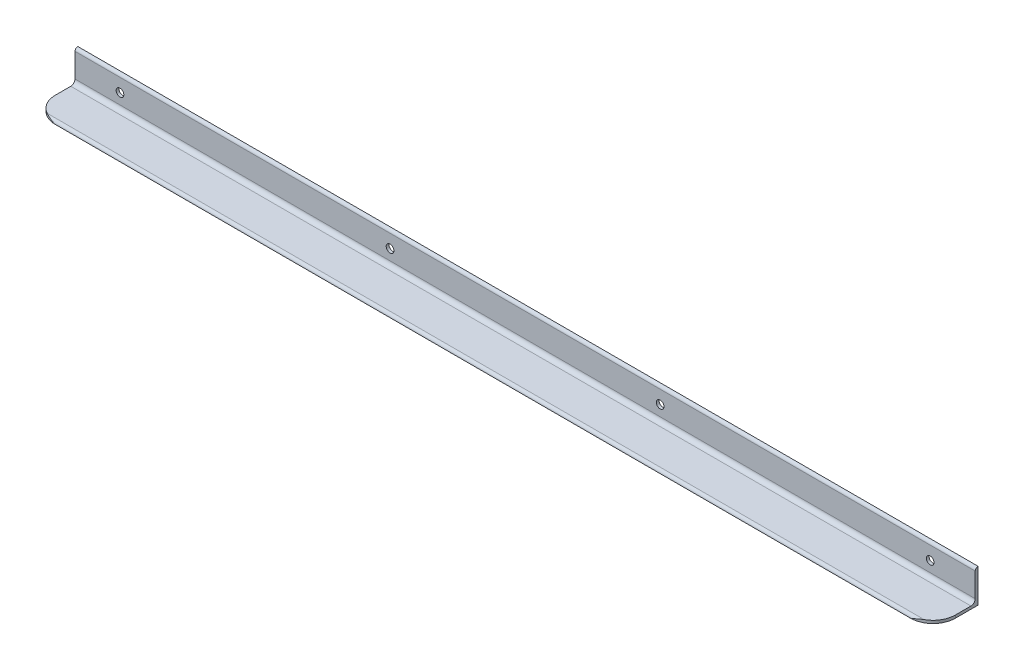
ISO-10303-21;
HEADER;
FILE_DESCRIPTION(('STEP AP214'),'2;1');
FILE_NAME('part.step','',(''),(''),'','','');
FILE_SCHEMA(('AUTOMOTIVE_DESIGN { 1 0 10303 214 1 1 1 1 }'));
ENDSEC;
DATA;
#1=APPLICATION_CONTEXT('core data for automotive mechanical design processes');
#2=APPLICATION_PROTOCOL_DEFINITION('international standard','automotive_design',2000,#1);
#3=PRODUCT_CONTEXT('',#1,'mechanical');
#4=PRODUCT('Part','Part','',(#3));
#5=PRODUCT_RELATED_PRODUCT_CATEGORY('part','',(#4));
#6=PRODUCT_DEFINITION_FORMATION('','',#4);
#7=PRODUCT_DEFINITION_CONTEXT('part definition',#1,'design');
#8=PRODUCT_DEFINITION('design','',#6,#7);
#9=PRODUCT_DEFINITION_SHAPE('','',#8);
#10=(LENGTH_UNIT() NAMED_UNIT(*) SI_UNIT(.MILLI.,.METRE.));
#11=(NAMED_UNIT(*) PLANE_ANGLE_UNIT() SI_UNIT($,.RADIAN.));
#12=(NAMED_UNIT(*) SI_UNIT($,.STERADIAN.) SOLID_ANGLE_UNIT());
#13=UNCERTAINTY_MEASURE_WITH_UNIT(LENGTH_MEASURE(1.E-05),#10,'distance_accuracy_value','');
#14=(GEOMETRIC_REPRESENTATION_CONTEXT(3) GLOBAL_UNCERTAINTY_ASSIGNED_CONTEXT((#13)) GLOBAL_UNIT_ASSIGNED_CONTEXT((#10,
#11,#12)) REPRESENTATION_CONTEXT('',''));
#15=CARTESIAN_POINT('',(0.,0.,0.));
#16=DIRECTION('',(0.,0.,1.));
#17=DIRECTION('',(1.,0.,0.));
#18=AXIS2_PLACEMENT_3D('',#15,#16,#17);
#19=CARTESIAN_POINT('',(508.,6.66133814775094E-13,50.7999999999862));
#20=DIRECTION('',(0.,0.,-0.999999999999999));
#21=DIRECTION('',(-0.999999999999999,0.,0.));
#22=AXIS2_PLACEMENT_3D('',#19,#20,#21);
#23=PLANE('',#22);
#24=DIRECTION('',(-0.999999999999999,0.,0.));
#25=VECTOR('',#24,1.);
#26=CARTESIAN_POINT('',(508.,6.66133814775094E-13,50.7999999999862));
#27=LINE('',#26,#25);
#28=CARTESIAN_POINT('',(482.599999999996,4.44089209850063E-13,50.7999999999865));
#29=VERTEX_POINT('',#28);
#30=CARTESIAN_POINT('',(-482.600000000003,4.44089209850063E-13,50.8000000000133));
#31=VERTEX_POINT('',#30);
#32=EDGE_CURVE('E173',#29,#31,#27,.T.);
#33=ORIENTED_EDGE('',*,*,#32,.F.);
#34=DIRECTION('',(0.,-1.,0.));
#35=VECTOR('',#34,1.);
#36=CARTESIAN_POINT('',(482.599999999996,38.1000000000041,50.799999999986));
#37=LINE('',#36,#35);
#38=CARTESIAN_POINT('',(482.599999999996,0.00508000000054576,50.7999999999862));
#39=VERTEX_POINT('',#38);
#40=EDGE_CURVE('E158',#39,#29,#37,.T.);
#41=ORIENTED_EDGE('',*,*,#40,.F.);
#42=DIRECTION('',(-0.999999999999999,0.,0.));
#43=VECTOR('',#42,1.);
#44=CARTESIAN_POINT('',(508.,0.00508000000065678,50.7999999999864));
#45=LINE('',#44,#43);
#46=CARTESIAN_POINT('',(-482.600000000003,0.0050800000007678,50.8000000000128));
#47=VERTEX_POINT('',#46);
#48=EDGE_CURVE('E179',#39,#47,#45,.T.);
#49=ORIENTED_EDGE('',*,*,#48,.T.);
#50=DIRECTION('',(0.,-1.,0.));
#51=VECTOR('',#50,1.);
#52=CARTESIAN_POINT('',(-482.600000000003,38.1000000000035,50.8000000000132));
#53=LINE('',#52,#51);
#54=EDGE_CURVE('E176',#47,#31,#53,.T.);
#55=ORIENTED_EDGE('',*,*,#54,.T.);
#56=EDGE_LOOP('',(#33,#41,#49,#55));
#57=FACE_BOUND('',#56,.T.);
#58=ADVANCED_FACE('F76',(#57),#23,.F.);
#59=CARTESIAN_POINT('',(507.999999999999,0.00508000000043474,47.6300799999864));
#60=DIRECTION('',(-0.999999999999999,0.,0.));
#61=DIRECTION('',(0.,0.,0.999999999999999));
#62=AXIS2_PLACEMENT_3D('',#59,#60,#61);
#63=PLANE('',#62);
#64=DIRECTION('',(0.,-1.,0.));
#65=VECTOR('',#64,1.);
#66=CARTESIAN_POINT('',(508.,38.1000000000039,25.3999999999862));
#67=LINE('',#66,#65);
#68=CARTESIAN_POINT('',(507.999999999999,4.44089209850063E-13,25.3999999999857));
#69=VERTEX_POINT('',#68);
#70=CARTESIAN_POINT('',(507.999999999999,3.17500000000037,25.3999999999859));
#71=VERTEX_POINT('',#70);
#72=EDGE_CURVE('E15',#69,#71,#67,.F.);
#73=ORIENTED_EDGE('',*,*,#72,.F.);
#74=DIRECTION('',(0.,0.,-0.999999999999999));
#75=VECTOR('',#74,1.);
#76=CARTESIAN_POINT('',(508.,7.7715611723761E-13,-1.4210854715202E-11));
#77=LINE('',#76,#75);
#78=CARTESIAN_POINT('',(508.,7.7715611723761E-13,-1.4210854715202E-11));
#79=VERTEX_POINT('',#78);
#80=EDGE_CURVE('E175',#69,#79,#77,.T.);
#81=ORIENTED_EDGE('',*,*,#80,.T.);
#82=DIRECTION('',(0.,1.,0.));
#83=VECTOR('',#82,1.);
#84=CARTESIAN_POINT('',(508.,38.1000000000036,-1.38777878078145E-11));
#85=LINE('',#84,#83);
#86=CARTESIAN_POINT('',(508.,38.1000000000036,-1.38777878078145E-11));
#87=VERTEX_POINT('',#86);
#88=EDGE_CURVE('E407',#79,#87,#85,.T.);
#89=ORIENTED_EDGE('',*,*,#88,.T.);
#90=DIRECTION('',(0.,0.,0.999999999999999));
#91=VECTOR('',#90,1.);
#92=CARTESIAN_POINT('',(508.,38.1000000000039,0.00507999998611286));
#93=LINE('',#92,#91);
#94=CARTESIAN_POINT('',(508.,38.1000000000039,0.00507999998611286));
#95=VERTEX_POINT('',#94);
#96=EDGE_CURVE('E409',#87,#95,#93,.T.);
#97=ORIENTED_EDGE('',*,*,#96,.T.);
#98=CARTESIAN_POINT('',(508.,34.9300800000039,0.00507999998611286));
#99=DIRECTION('',(0.999999999999999,0.,0.));
#100=DIRECTION('',(0.,0.,-0.999999999999999));
#101=AXIS2_PLACEMENT_3D('',#98,#99,#100);
#102=CIRCLE('',#101,3.16992);
#103=CARTESIAN_POINT('',(508.,34.9300800000041,3.17499999998605));
#104=VERTEX_POINT('',#103);
#105=EDGE_CURVE('E411',#95,#104,#102,.T.);
#106=ORIENTED_EDGE('',*,*,#105,.T.);
#107=DIRECTION('',(0.,-1.,0.));
#108=VECTOR('',#107,1.);
#109=CARTESIAN_POINT('',(508.,7.95020000000057,3.17499999998627));
#110=LINE('',#109,#108);
#111=CARTESIAN_POINT('',(508.,7.95020000000057,3.17499999998627));
#112=VERTEX_POINT('',#111);
#113=EDGE_CURVE('E415',#104,#112,#110,.T.);
#114=ORIENTED_EDGE('',*,*,#113,.T.);
#115=CARTESIAN_POINT('',(507.999999999999,7.95020000000057,7.95019999998636));
#116=DIRECTION('',(-0.999999999999999,0.,0.));
#117=DIRECTION('',(0.,0.,0.999999999999999));
#118=AXIS2_PLACEMENT_3D('',#115,#116,#117);
#119=CIRCLE('',#118,4.7752);
#120=CARTESIAN_POINT('',(507.999999999999,3.17500000000037,7.95019999998603));
#121=VERTEX_POINT('',#120);
#122=EDGE_CURVE('E417',#112,#121,#119,.T.);
#123=ORIENTED_EDGE('',*,*,#122,.T.);
#124=DIRECTION('',(0.,0.,0.999999999999999));
#125=VECTOR('',#124,1.);
#126=CARTESIAN_POINT('',(508.,3.17500000000037,47.6300799999861));
#127=LINE('',#126,#125);
#128=EDGE_CURVE('E418',#121,#71,#127,.T.);
#129=ORIENTED_EDGE('',*,*,#128,.T.);
#130=EDGE_LOOP('',(#73,#81,#89,#97,#106,#114,#123,#129));
#131=FACE_BOUND('',#130,.T.);
#132=ADVANCED_FACE('F243',(#131),#63,.F.);
#133=CARTESIAN_POINT('',(-508.,0.00508000000032371,47.630080000013));
#134=DIRECTION('',(-0.999999999999999,0.,0.));
#135=DIRECTION('',(0.,0.,0.999999999999999));
#136=AXIS2_PLACEMENT_3D('',#133,#134,#135);
#137=PLANE('',#136);
#138=DIRECTION('',(0.,0.,-0.999999999999999));
#139=VECTOR('',#138,1.);
#140=CARTESIAN_POINT('',(-507.999999999999,5.55111512312578E-13,1.28785870856518E-11));
#141=LINE('',#140,#139);
#142=CARTESIAN_POINT('',(-507.999999999999,4.44089209850063E-13,25.4000000000129));
#143=VERTEX_POINT('',#142);
#144=CARTESIAN_POINT('',(-507.999999999999,5.55111512312578E-13,1.28785870856518E-11));
#145=VERTEX_POINT('',#144);
#146=EDGE_CURVE('E406',#143,#145,#141,.T.);
#147=ORIENTED_EDGE('',*,*,#146,.F.);
#148=DIRECTION('',(0.,-1.,0.));
#149=VECTOR('',#148,1.);
#150=CARTESIAN_POINT('',(-507.999999999999,38.1000000000037,25.400000000013));
#151=LINE('',#150,#149);
#152=CARTESIAN_POINT('',(-507.999999999999,3.17500000000048,25.4000000000131));
#153=VERTEX_POINT('',#152);
#154=EDGE_CURVE('E85',#143,#153,#151,.F.);
#155=ORIENTED_EDGE('',*,*,#154,.T.);
#156=DIRECTION('',(0.,0.,0.999999999999999));
#157=VECTOR('',#156,1.);
#158=CARTESIAN_POINT('',(-508.,3.17500000000071,47.6300800000133));
#159=LINE('',#158,#157);
#160=CARTESIAN_POINT('',(-507.999999999999,3.17500000000059,7.95020000001323));
#161=VERTEX_POINT('',#160);
#162=EDGE_CURVE('E404',#161,#153,#159,.T.);
#163=ORIENTED_EDGE('',*,*,#162,.F.);
#164=CARTESIAN_POINT('',(-508.,7.95020000000046,7.95020000001301));
#165=DIRECTION('',(-0.999999999999999,0.,0.));
#166=DIRECTION('',(0.,0.,0.999999999999999));
#167=AXIS2_PLACEMENT_3D('',#164,#165,#166);
#168=CIRCLE('',#167,4.7752);
#169=CARTESIAN_POINT('',(-508.,7.95020000000046,3.17500000001336));
#170=VERTEX_POINT('',#169);
#171=EDGE_CURVE('E402',#170,#161,#168,.T.);
#172=ORIENTED_EDGE('',*,*,#171,.F.);
#173=DIRECTION('',(0.,-1.,0.));
#174=VECTOR('',#173,1.);
#175=CARTESIAN_POINT('',(-508.,7.95020000000046,3.17500000001336));
#176=LINE('',#175,#174);
#177=CARTESIAN_POINT('',(-507.999999999999,34.9300800000038,3.17500000001292));
#178=VERTEX_POINT('',#177);
#179=EDGE_CURVE('E400',#178,#170,#176,.T.);
#180=ORIENTED_EDGE('',*,*,#179,.F.);
#181=CARTESIAN_POINT('',(-508.,34.9300800000036,0.00508000001309128));
#182=DIRECTION('',(0.999999999999999,0.,0.));
#183=DIRECTION('',(0.,0.,-0.999999999999999));
#184=AXIS2_PLACEMENT_3D('',#181,#182,#183);
#185=CIRCLE('',#184,3.16992);
#186=CARTESIAN_POINT('',(-507.999999999999,38.1000000000038,0.00508000001342435));
#187=VERTEX_POINT('',#186);
#188=EDGE_CURVE('E392',#187,#178,#185,.T.);
#189=ORIENTED_EDGE('',*,*,#188,.F.);
#190=DIRECTION('',(0.,0.,0.999999999999999));
#191=VECTOR('',#190,1.);
#192=CARTESIAN_POINT('',(-507.999999999999,38.1000000000038,0.00508000001342435));
#193=LINE('',#192,#191);
#194=CARTESIAN_POINT('',(-507.999999999999,38.1000000000035,1.32116539930394E-11));
#195=VERTEX_POINT('',#194);
#196=EDGE_CURVE('E389',#195,#187,#193,.T.);
#197=ORIENTED_EDGE('',*,*,#196,.F.);
#198=DIRECTION('',(0.,1.,0.));
#199=VECTOR('',#198,1.);
#200=CARTESIAN_POINT('',(-507.999999999999,38.1000000000035,1.32116539930394E-11));
#201=LINE('',#200,#199);
#202=EDGE_CURVE('E386',#145,#195,#201,.T.);
#203=ORIENTED_EDGE('',*,*,#202,.F.);
#204=EDGE_LOOP('',(#147,#155,#163,#172,#180,#189,#197,#203));
#205=FACE_BOUND('',#204,.T.);
#206=ADVANCED_FACE('F246',(#205),#137,.T.);
#207=CARTESIAN_POINT('',(508.,38.1000000000036,-1.38777878078145E-11));
#208=DIRECTION('',(0.,0.,0.999999999999999));
#209=DIRECTION('',(0.,-1.,0.));
#210=AXIS2_PLACEMENT_3D('',#207,#208,#209);
#211=PLANE('',#210);
#212=CARTESIAN_POINT('',(-457.200000000003,20.0000000000102,1.31006316905768E-11));
#213=DIRECTION('',(0.,0.,-0.999999999999999));
#214=DIRECTION('',(0.,1.,0.));
#215=AXIS2_PLACEMENT_3D('',#212,#213,#214);
#216=CIRCLE('',#215,4.34974999999998);
#217=CARTESIAN_POINT('',(-457.200000000002,24.3497500000134,1.31006316905768E-11));
#218=VERTEX_POINT('',#217);
#219=EDGE_CURVE('E210',#218,#218,#216,.T.);
#220=ORIENTED_EDGE('',*,*,#219,.F.);
#221=EDGE_LOOP('',(#220));
#222=FACE_BOUND('',#221,.T.);
#223=CARTESIAN_POINT('',(-152.4,20.0000000000082,1.31006316905768E-11));
#224=DIRECTION('',(0.,0.,-0.999999999999999));
#225=DIRECTION('',(0.,1.,0.));
#226=AXIS2_PLACEMENT_3D('',#223,#224,#225);
#227=CIRCLE('',#226,4.34974999999998);
#228=CARTESIAN_POINT('',(-152.399999999999,24.349750000008,1.31006316905768E-11));
#229=VERTEX_POINT('',#228);
#230=EDGE_CURVE('E369',#229,#229,#227,.T.);
#231=ORIENTED_EDGE('',*,*,#230,.F.);
#232=EDGE_LOOP('',(#231));
#233=FACE_BOUND('',#232,.T.);
#234=CARTESIAN_POINT('',(152.4,20.0000000000057,-4.44089209850063E-13));
#235=DIRECTION('',(0.,0.,-0.999999999999999));
#236=DIRECTION('',(0.,1.,0.));
#237=AXIS2_PLACEMENT_3D('',#234,#235,#236);
#238=CIRCLE('',#237,4.34974999999998);
#239=CARTESIAN_POINT('',(152.400000000001,24.3497500000059,-4.44089209850063E-13));
#240=VERTEX_POINT('',#239);
#241=EDGE_CURVE('E372',#240,#240,#238,.T.);
#242=ORIENTED_EDGE('',*,*,#241,.F.);
#243=EDGE_LOOP('',(#242));
#244=FACE_BOUND('',#243,.T.);
#245=CARTESIAN_POINT('',(457.199999999996,20.0000000000036,-1.36557432028894E-11));
#246=DIRECTION('',(0.,0.,-0.999999999999999));
#247=DIRECTION('',(0.,1.,0.));
#248=AXIS2_PLACEMENT_3D('',#245,#246,#247);
#249=CIRCLE('',#248,4.34974999999998);
#250=CARTESIAN_POINT('',(457.199999999997,24.349750000007,-1.36557432028894E-11));
#251=VERTEX_POINT('',#250);
#252=EDGE_CURVE('E377',#251,#251,#249,.T.);
#253=ORIENTED_EDGE('',*,*,#252,.F.);
#254=EDGE_LOOP('',(#253));
#255=FACE_BOUND('',#254,.T.);
#256=ORIENTED_EDGE('',*,*,#202,.T.);
#257=DIRECTION('',(-0.999999999999999,0.,0.));
#258=VECTOR('',#257,1.);
#259=CARTESIAN_POINT('',(508.,38.1000000000036,-1.38777878078145E-11));
#260=LINE('',#259,#258);
#261=EDGE_CURVE('E202',#87,#195,#260,.T.);
#262=ORIENTED_EDGE('',*,*,#261,.F.);
#263=ORIENTED_EDGE('',*,*,#88,.F.);
#264=DIRECTION('',(-0.999999999999999,0.,0.));
#265=VECTOR('',#264,1.);
#266=CARTESIAN_POINT('',(508.,7.7715611723761E-13,-1.4210854715202E-11));
#267=LINE('',#266,#265);
#268=EDGE_CURVE('E180',#79,#145,#267,.T.);
#269=ORIENTED_EDGE('',*,*,#268,.T.);
#270=EDGE_LOOP('',(#256,#262,#263,#269));
#271=FACE_BOUND('',#270,.T.);
#272=ADVANCED_FACE('F78',(#222,#233,#244,#255,#271),#211,.F.);
#273=CARTESIAN_POINT('',(508.,38.1000000000039,0.00507999998611286));
#274=DIRECTION('',(0.,-1.,0.));
#275=DIRECTION('',(0.,0.,-0.999999999999999));
#276=AXIS2_PLACEMENT_3D('',#273,#274,#275);
#277=PLANE('',#276);
#278=ORIENTED_EDGE('',*,*,#196,.T.);
#279=DIRECTION('',(-0.999999999999999,0.,0.));
#280=VECTOR('',#279,1.);
#281=CARTESIAN_POINT('',(508.,38.1000000000039,0.00507999998611286));
#282=LINE('',#281,#280);
#283=EDGE_CURVE('E199',#95,#187,#282,.T.);
#284=ORIENTED_EDGE('',*,*,#283,.F.);
#285=ORIENTED_EDGE('',*,*,#96,.F.);
#286=ORIENTED_EDGE('',*,*,#261,.T.);
#287=EDGE_LOOP('',(#278,#284,#285,#286));
#288=FACE_BOUND('',#287,.T.);
#289=ADVANCED_FACE('F270',(#288),#277,.F.);
#290=CARTESIAN_POINT('',(508.,34.9300800000039,0.00507999998611286));
#291=DIRECTION('',(-0.999999999999999,0.,0.));
#292=DIRECTION('',(0.,0.,0.999999999999999));
#293=AXIS2_PLACEMENT_3D('',#290,#291,#292);
#294=CYLINDRICAL_SURFACE('',#293,3.16992);
#295=ORIENTED_EDGE('',*,*,#188,.T.);
#296=DIRECTION('',(-0.999999999999999,0.,0.));
#297=VECTOR('',#296,1.);
#298=CARTESIAN_POINT('',(508.,34.9300800000041,3.17499999998605));
#299=LINE('',#298,#297);
#300=EDGE_CURVE('E196',#104,#178,#299,.T.);
#301=ORIENTED_EDGE('',*,*,#300,.F.);
#302=ORIENTED_EDGE('',*,*,#105,.F.);
#303=ORIENTED_EDGE('',*,*,#283,.T.);
#304=EDGE_LOOP('',(#295,#301,#302,#303));
#305=FACE_BOUND('',#304,.T.);
#306=ADVANCED_FACE('F277',(#305),#294,.T.);
#307=CARTESIAN_POINT('',(508.,7.95020000000057,3.17499999998627));
#308=DIRECTION('',(0.,0.,-0.999999999999999));
#309=DIRECTION('',(0.,1.,0.));
#310=AXIS2_PLACEMENT_3D('',#307,#308,#309);
#311=PLANE('',#310);
#312=CARTESIAN_POINT('',(-457.200000000003,20.0000000000101,3.17500000001292));
#313=DIRECTION('',(0.,0.,-0.999999999999999));
#314=DIRECTION('',(0.,1.,0.));
#315=AXIS2_PLACEMENT_3D('',#312,#313,#314);
#316=CIRCLE('',#315,4.34974999999998);
#317=CARTESIAN_POINT('',(-457.200000000002,24.3497500000134,3.17500000001292));
#318=VERTEX_POINT('',#317);
#319=EDGE_CURVE('E80',#318,#318,#316,.T.);
#320=ORIENTED_EDGE('',*,*,#319,.T.);
#321=EDGE_LOOP('',(#320));
#322=FACE_BOUND('',#321,.T.);
#323=CARTESIAN_POINT('',(-152.4,20.0000000000081,3.17500000001314));
#324=DIRECTION('',(0.,0.,-0.999999999999999));
#325=DIRECTION('',(0.,1.,0.));
#326=AXIS2_PLACEMENT_3D('',#323,#324,#325);
#327=CIRCLE('',#326,4.34974999999998);
#328=CARTESIAN_POINT('',(-152.399999999999,24.349750000008,3.17500000001315));
#329=VERTEX_POINT('',#328);
#330=EDGE_CURVE('E212',#329,#329,#327,.T.);
#331=ORIENTED_EDGE('',*,*,#330,.T.);
#332=EDGE_LOOP('',(#331));
#333=FACE_BOUND('',#332,.T.);
#334=CARTESIAN_POINT('',(152.4,20.0000000000058,3.17499999999948));
#335=DIRECTION('',(0.,0.,-0.999999999999999));
#336=DIRECTION('',(0.,1.,0.));
#337=AXIS2_PLACEMENT_3D('',#334,#335,#336);
#338=CIRCLE('',#337,4.34974999999998);
#339=CARTESIAN_POINT('',(152.400000000001,24.3497500000059,3.17499999999949));
#340=VERTEX_POINT('',#339);
#341=EDGE_CURVE('E209',#340,#340,#338,.T.);
#342=ORIENTED_EDGE('',*,*,#341,.T.);
#343=EDGE_LOOP('',(#342));
#344=FACE_BOUND('',#343,.T.);
#345=CARTESIAN_POINT('',(457.199999999996,20.0000000000039,3.17499999998583));
#346=DIRECTION('',(0.,0.,-0.999999999999999));
#347=DIRECTION('',(0.,1.,0.));
#348=AXIS2_PLACEMENT_3D('',#345,#346,#347);
#349=CIRCLE('',#348,4.34974999999998);
#350=CARTESIAN_POINT('',(457.199999999997,24.349750000007,3.17499999998584));
#351=VERTEX_POINT('',#350);
#352=EDGE_CURVE('E206',#351,#351,#349,.T.);
#353=ORIENTED_EDGE('',*,*,#352,.T.);
#354=EDGE_LOOP('',(#353));
#355=FACE_BOUND('',#354,.T.);
#356=ORIENTED_EDGE('',*,*,#179,.T.);
#357=DIRECTION('',(-0.999999999999999,0.,0.));
#358=VECTOR('',#357,1.);
#359=CARTESIAN_POINT('',(508.,7.95020000000057,3.17499999998627));
#360=LINE('',#359,#358);
#361=EDGE_CURVE('E193',#112,#170,#360,.T.);
#362=ORIENTED_EDGE('',*,*,#361,.F.);
#363=ORIENTED_EDGE('',*,*,#113,.F.);
#364=ORIENTED_EDGE('',*,*,#300,.T.);
#365=EDGE_LOOP('',(#356,#362,#363,#364));
#366=FACE_BOUND('',#365,.T.);
#367=ADVANCED_FACE('F285',(#322,#333,#344,#355,#366),#311,.F.);
#368=CARTESIAN_POINT('',(507.999999999999,7.95020000000057,7.95019999998636));
#369=DIRECTION('',(-0.999999999999999,0.,0.));
#370=DIRECTION('',(0.,0.,0.999999999999999));
#371=AXIS2_PLACEMENT_3D('',#368,#369,#370);
#372=CYLINDRICAL_SURFACE('',#371,4.7752);
#373=ORIENTED_EDGE('',*,*,#171,.T.);
#374=DIRECTION('',(-0.999999999999999,0.,0.));
#375=VECTOR('',#374,1.);
#376=CARTESIAN_POINT('',(507.999999999999,3.17500000000037,7.95019999998603));
#377=LINE('',#376,#375);
#378=EDGE_CURVE('E190',#121,#161,#377,.T.);
#379=ORIENTED_EDGE('',*,*,#378,.F.);
#380=ORIENTED_EDGE('',*,*,#122,.F.);
#381=ORIENTED_EDGE('',*,*,#361,.T.);
#382=EDGE_LOOP('',(#373,#379,#380,#381));
#383=FACE_BOUND('',#382,.T.);
#384=ADVANCED_FACE('F294',(#383),#372,.F.);
#385=CARTESIAN_POINT('',(508.,3.17500000000037,47.6300799999861));
#386=DIRECTION('',(0.,-1.,0.));
#387=DIRECTION('',(0.,0.,-0.999999999999999));
#388=AXIS2_PLACEMENT_3D('',#385,#386,#387);
#389=PLANE('',#388);
#390=DIRECTION('',(-0.999999999999999,0.,0.));
#391=VECTOR('',#390,1.);
#392=CARTESIAN_POINT('',(508.,3.17500000000037,47.6300799999861));
#393=LINE('',#392,#391);
#394=CARTESIAN_POINT('',(494.887536091236,3.17500000000026,47.6300799999861));
#395=VERTEX_POINT('',#394);
#396=CARTESIAN_POINT('',(-494.887536091249,3.17500000000048,47.6300800000128));
#397=VERTEX_POINT('',#396);
#398=EDGE_CURVE('E182',#395,#397,#393,.T.);
#399=ORIENTED_EDGE('',*,*,#398,.F.);
#400=CARTESIAN_POINT('',(482.599999999996,3.17500000000037,25.3999999999861));
#401=DIRECTION('',(0.,-1.,0.));
#402=DIRECTION('',(0.,0.,-0.999999999999999));
#403=AXIS2_PLACEMENT_3D('',#400,#401,#402);
#404=CIRCLE('',#403,25.4);
#405=EDGE_CURVE('E390',#395,#71,#404,.F.);
#406=ORIENTED_EDGE('',*,*,#405,.T.);
#407=ORIENTED_EDGE('',*,*,#128,.F.);
#408=ORIENTED_EDGE('',*,*,#378,.T.);
#409=ORIENTED_EDGE('',*,*,#162,.T.);
#410=CARTESIAN_POINT('',(-482.600000000003,3.17500000000037,25.4000000000131));
#411=DIRECTION('',(0.,-1.,0.));
#412=DIRECTION('',(0.,0.,-0.999999999999999));
#413=AXIS2_PLACEMENT_3D('',#410,#411,#412);
#414=CIRCLE('',#413,25.4);
#415=EDGE_CURVE('E100',#153,#397,#414,.F.);
#416=ORIENTED_EDGE('',*,*,#415,.T.);
#417=EDGE_LOOP('',(#399,#406,#407,#408,#409,#416));
#418=FACE_BOUND('',#417,.T.);
#419=ADVANCED_FACE('F302',(#418),#389,.F.);
#420=CARTESIAN_POINT('',(507.999999999999,0.00508000000043474,47.6300799999864));
#421=DIRECTION('',(-0.999999999999999,0.,0.));
#422=DIRECTION('',(0.,0.,0.999999999999999));
#423=AXIS2_PLACEMENT_3D('',#420,#421,#422);
#424=CYLINDRICAL_SURFACE('',#423,3.16992);
#425=ORIENTED_EDGE('',*,*,#48,.F.);
#426=CARTESIAN_POINT('',(494.887536091236,3.17500000000026,47.6300799999864));
#427=CARTESIAN_POINT('',(494.703645093051,3.17496758256043,47.7317306982117));
#428=CARTESIAN_POINT('',(494.518532595527,3.17011223210147,47.8310656184791));
#429=CARTESIAN_POINT('',(494.146310861027,3.15182822361584,48.0249120274286));
#430=CARTESIAN_POINT('',(493.959202520207,3.13840326625615,48.1194255791363));
#431=CARTESIAN_POINT('',(493.583675871723,3.10408726840101,48.3033295465865));
#432=CARTESIAN_POINT('',(493.395261197551,3.08321217146752,48.3927304331959));
#433=CARTESIAN_POINT('',(493.016982735481,3.03485290274428,48.5665666511941));
#434=CARTESIAN_POINT('',(492.827118772703,3.00736792076545,48.6510013722883));
#435=CARTESIAN_POINT('',(492.257478676025,2.91644742719935,48.896029733588));
#436=CARTESIAN_POINT('',(491.875863552564,2.84436770030226,49.0492229848649));
#437=CARTESIAN_POINT('',(491.108907261331,2.68197839595933,49.3358789621423));
#438=CARTESIAN_POINT('',(490.723563551615,2.59165540431923,49.469327043775));
#439=CARTESIAN_POINT('',(490.019949200158,2.41420186355527,49.6943428394534));
#440=CARTESIAN_POINT('',(489.702102320424,2.32942795818762,49.7891242863689));
#441=CARTESIAN_POINT('',(489.065006736476,2.15193777357284,49.9656870383624));
#442=CARTESIAN_POINT('',(488.745757874458,2.05922057731978,50.0474668393569));
#443=CARTESIAN_POINT('',(487.786203153283,1.77139374468499,50.2735862066151));
#444=CARTESIAN_POINT('',(487.144163003908,1.5666281826259,50.3986822430562));
#445=CARTESIAN_POINT('',(485.857195818785,1.14124703100641,50.5987161070003));
#446=CARTESIAN_POINT('',(485.212266886568,0.920618910285582,50.6736137856589));
#447=CARTESIAN_POINT('',(483.921498379098,0.471877864161825,50.773849045656));
#448=CARTESIAN_POINT('',(483.27565965579,0.243769841622297,50.7992184562657));
#449=CARTESIAN_POINT('',(482.620036264536,0.012158218114118,50.7999940707724));
#450=CARTESIAN_POINT('',(482.610018102474,0.00861909759601177,50.7999999975982));
#451=CARTESIAN_POINT('',(482.599999999996,0.00508000000054576,50.7999999999862));
#452=B_SPLINE_CURVE_WITH_KNOTS('',3,(#426,#427,#428,#429,#430,#431,#432,#433,#434,#435,#436,
#437,#438,#439,#440,#441,#442,#443,#444,#445,#446,#447,#448,#449,#450,#451),.UNSPECIFIED.,.F.,
.F.,(4,2,2,2,2,2,2,2,2,2,2,2,4),(0.,0.630202801960099,1.26013364343721,1.8887244154567,
2.51739227462303,3.76873989216241,5.02101099197768,6.04766762521563,7.07444294000814,
9.12823236816713,11.1836624712252,13.2377712196659,13.2696459795264),.UNSPECIFIED.);
#453=EDGE_CURVE('E161',#39,#395,#452,.F.);
#454=ORIENTED_EDGE('',*,*,#453,.T.);
#455=ORIENTED_EDGE('',*,*,#398,.T.);
#456=CARTESIAN_POINT('',(-494.887536091249,3.17500000000048,47.6300800000128));
#457=CARTESIAN_POINT('',(-494.703645093063,3.17496758256019,47.7317306982364));
#458=CARTESIAN_POINT('',(-494.518532595539,3.17011223210089,47.8310656185031));
#459=CARTESIAN_POINT('',(-494.14631086104,3.15182822361465,48.024912027452));
#460=CARTESIAN_POINT('',(-493.95920252022,3.13840326625471,48.1194255791598));
#461=CARTESIAN_POINT('',(-493.583675871736,3.10408726839899,48.3033295466102));
#462=CARTESIAN_POINT('',(-493.395261197565,3.08321217146516,48.3927304332195));
#463=CARTESIAN_POINT('',(-493.016982735494,3.03485290274143,48.5665666512178));
#464=CARTESIAN_POINT('',(-492.827118772717,3.00736792076244,48.6510013723121));
#465=CARTESIAN_POINT('',(-492.257478676038,2.91644742719476,48.8960297336118));
#466=CARTESIAN_POINT('',(-491.875863552577,2.84436770029518,49.0492229848884));
#467=CARTESIAN_POINT('',(-491.108907261344,2.68197839595517,49.3358789621672));
#468=CARTESIAN_POINT('',(-490.723563551627,2.5916554043205,49.4693270438015));
#469=CARTESIAN_POINT('',(-490.019949200171,2.41420186355383,49.6943428394796));
#470=CARTESIAN_POINT('',(-489.702102320438,2.32942795818032,49.7891242863938));
#471=CARTESIAN_POINT('',(-489.065006736492,2.1519377735595,49.9656870383864));
#472=CARTESIAN_POINT('',(-488.745757874474,2.05922057730626,50.0474668393814));
#473=CARTESIAN_POINT('',(-487.786203153298,1.77139374467171,50.2735862066404));
#474=CARTESIAN_POINT('',(-487.144163003921,1.56662818261388,50.3986822430816));
#475=CARTESIAN_POINT('',(-485.857195818805,1.14124703097133,50.5987161070252));
#476=CARTESIAN_POINT('',(-485.212266886596,0.920618910226175,50.6736137856831));
#477=CARTESIAN_POINT('',(-483.92149837912,0.471877864120157,50.7738490456824));
#478=CARTESIAN_POINT('',(-483.275659655797,0.243769841622654,50.799218456295));
#479=CARTESIAN_POINT('',(-482.620036264543,0.0121582181140913,50.7999940707993));
#480=CARTESIAN_POINT('',(-482.610018102481,0.00861909759594815,50.7999999976251));
#481=CARTESIAN_POINT('',(-482.600000000003,0.00508000000043474,50.8000000000131));
#482=B_SPLINE_CURVE_WITH_KNOTS('',3,(#456,#457,#458,#459,#460,#461,#462,#463,#464,#465,#466,
#467,#468,#469,#470,#471,#472,#473,#474,#475,#476,#477,#478,#479,#480,#481),.UNSPECIFIED.,.F.,
.F.,(4,2,2,2,2,2,2,2,2,2,2,2,4),(0.,0.630202801959317,1.26013364343571,1.88872441545531,
2.51739227462166,3.76873989216154,5.02101099197689,6.04766762521479,7.0744429400079,
9.12823236816886,11.1836624712278,13.2377712196688,13.2696459795294),.UNSPECIFIED.);
#483=EDGE_CURVE('E166',#397,#47,#482,.T.);
#484=ORIENTED_EDGE('',*,*,#483,.T.);
#485=EDGE_LOOP('',(#425,#454,#455,#484));
#486=FACE_BOUND('',#485,.T.);
#487=ADVANCED_FACE('F232',(#486),#424,.T.);
#488=CARTESIAN_POINT('',(508.,7.7715611723761E-13,-1.4210854715202E-11));
#489=DIRECTION('',(0.,1.,0.));
#490=DIRECTION('',(0.,0.,0.999999999999999));
#491=AXIS2_PLACEMENT_3D('',#488,#489,#490);
#492=PLANE('',#491);
#493=ORIENTED_EDGE('',*,*,#80,.F.);
#494=CARTESIAN_POINT('',(482.599999999996,4.44089209850063E-13,25.3999999999862));
#495=DIRECTION('',(0.,1.,0.));
#496=DIRECTION('',(0.,0.,0.999999999999999));
#497=AXIS2_PLACEMENT_3D('',#494,#495,#496);
#498=CIRCLE('',#497,25.4);
#499=EDGE_CURVE('E92',#29,#69,#498,.T.);
#500=ORIENTED_EDGE('',*,*,#499,.F.);
#501=ORIENTED_EDGE('',*,*,#32,.T.);
#502=CARTESIAN_POINT('',(-482.600000000003,4.44089209850063E-13,25.4000000000133));
#503=DIRECTION('',(0.,1.,0.));
#504=DIRECTION('',(0.,0.,-0.999999999999999));
#505=AXIS2_PLACEMENT_3D('',#502,#503,#504);
#506=CIRCLE('',#505,25.4);
#507=EDGE_CURVE('E217',#143,#31,#506,.T.);
#508=ORIENTED_EDGE('',*,*,#507,.F.);
#509=ORIENTED_EDGE('',*,*,#146,.T.);
#510=ORIENTED_EDGE('',*,*,#268,.F.);
#511=EDGE_LOOP('',(#493,#500,#501,#508,#509,#510));
#512=FACE_BOUND('',#511,.T.);
#513=ADVANCED_FACE('F171',(#512),#492,.F.);
#514=CARTESIAN_POINT('',(-482.600000000003,38.1000000000037,25.4000000000127));
#515=DIRECTION('',(0.,-1.,0.));
#516=DIRECTION('',(0.,0.,-0.999999999999999));
#517=AXIS2_PLACEMENT_3D('',#514,#515,#516);
#518=CYLINDRICAL_SURFACE('',#517,25.4);
#519=ORIENTED_EDGE('',*,*,#154,.F.);
#520=ORIENTED_EDGE('',*,*,#507,.T.);
#521=ORIENTED_EDGE('',*,*,#54,.F.);
#522=ORIENTED_EDGE('',*,*,#483,.F.);
#523=ORIENTED_EDGE('',*,*,#415,.F.);
#524=EDGE_LOOP('',(#519,#520,#521,#522,#523));
#525=FACE_BOUND('',#524,.T.);
#526=ADVANCED_FACE('F236',(#525),#518,.T.);
#527=CARTESIAN_POINT('',(482.599999999996,38.100000000004,25.399999999986));
#528=DIRECTION('',(0.,-1.,0.));
#529=DIRECTION('',(0.,0.,-0.999999999999999));
#530=AXIS2_PLACEMENT_3D('',#527,#528,#529);
#531=CYLINDRICAL_SURFACE('',#530,25.4);
#532=ORIENTED_EDGE('',*,*,#453,.F.);
#533=ORIENTED_EDGE('',*,*,#40,.T.);
#534=ORIENTED_EDGE('',*,*,#499,.T.);
#535=ORIENTED_EDGE('',*,*,#72,.T.);
#536=ORIENTED_EDGE('',*,*,#405,.F.);
#537=EDGE_LOOP('',(#532,#533,#534,#535,#536));
#538=FACE_BOUND('',#537,.T.);
#539=ADVANCED_FACE('F159',(#538),#531,.T.);
#540=CARTESIAN_POINT('',(457.199999999996,20.000000000007,50.799999999986));
#541=DIRECTION('',(0.,0.,-0.999999999999999));
#542=DIRECTION('',(0.,1.,0.));
#543=AXIS2_PLACEMENT_3D('',#540,#541,#542);
#544=CYLINDRICAL_SURFACE('',#543,4.34974999999998);
#545=CARTESIAN_POINT('',(457.199999999997,24.349750000007,-1.36557432028894E-11));
#546=CARTESIAN_POINT('',(457.199999999997,24.349750000007,0.0330729166530055));
#547=CARTESIAN_POINT('',(457.199999999997,24.349750000007,0.0661458333196668));
#548=CARTESIAN_POINT('',(457.199999999997,24.349750000007,0.132291666652989));
#549=CARTESIAN_POINT('',(457.199999999997,24.349750000007,0.165364583319651));
#550=CARTESIAN_POINT('',(457.199999999997,24.349750000007,0.231510416652973));
#551=CARTESIAN_POINT('',(457.199999999997,24.349750000007,0.264583333319635));
#552=CARTESIAN_POINT('',(457.199999999997,24.349750000007,0.330729166652957));
#553=CARTESIAN_POINT('',(457.199999999997,24.349750000007,0.363802083319618));
#554=CARTESIAN_POINT('',(457.199999999997,24.349750000007,0.429947916652941));
#555=CARTESIAN_POINT('',(457.199999999997,24.349750000007,0.463020833319602));
#556=CARTESIAN_POINT('',(457.199999999997,24.349750000007,0.529166666652925));
#557=CARTESIAN_POINT('',(457.199999999997,24.349750000007,0.562239583319586));
#558=CARTESIAN_POINT('',(457.199999999997,24.349750000007,0.628385416652909));
#559=CARTESIAN_POINT('',(457.199999999997,24.349750000007,0.66145833331957));
#560=CARTESIAN_POINT('',(457.199999999997,24.349750000007,0.727604166652893));
#561=CARTESIAN_POINT('',(457.199999999997,24.349750000007,0.760677083319554));
#562=CARTESIAN_POINT('',(457.199999999997,24.349750000007,0.826822916652879));
#563=CARTESIAN_POINT('',(457.199999999997,24.349750000007,0.859895833319542));
#564=CARTESIAN_POINT('',(457.199999999997,24.349750000007,0.926041666652867));
#565=CARTESIAN_POINT('',(457.199999999997,24.349750000007,0.959114583319529));
#566=CARTESIAN_POINT('',(457.199999999997,24.349750000007,1.02526041665285));
#567=CARTESIAN_POINT('',(457.199999999997,24.349750000007,1.05833333331951));
#568=CARTESIAN_POINT('',(457.199999999997,24.349750000007,1.12447916665284));
#569=CARTESIAN_POINT('',(457.199999999997,24.349750000007,1.1575520833195));
#570=CARTESIAN_POINT('',(457.199999999997,24.349750000007,1.22369791665282));
#571=CARTESIAN_POINT('',(457.199999999997,24.349750000007,1.25677083331948));
#572=CARTESIAN_POINT('',(457.199999999997,24.349750000007,1.3229166666528));
#573=CARTESIAN_POINT('',(457.199999999997,24.349750000007,1.35598958331946));
#574=CARTESIAN_POINT('',(457.199999999997,24.349750000007,1.42213541665278));
#575=CARTESIAN_POINT('',(457.199999999997,24.349750000007,1.45520833331944));
#576=CARTESIAN_POINT('',(457.199999999997,24.349750000007,1.52135416665276));
#577=CARTESIAN_POINT('',(457.199999999997,24.349750000007,1.55442708331942));
#578=CARTESIAN_POINT('',(457.199999999997,24.349750000007,1.62057291665275));
#579=CARTESIAN_POINT('',(457.199999999997,24.349750000007,1.65364583331941));
#580=CARTESIAN_POINT('',(457.199999999997,24.349750000007,1.71979166665273));
#581=CARTESIAN_POINT('',(457.199999999997,24.349750000007,1.75286458331939));
#582=CARTESIAN_POINT('',(457.199999999997,24.349750000007,1.81901041665272));
#583=CARTESIAN_POINT('',(457.199999999997,24.349750000007,1.85208333331938));
#584=CARTESIAN_POINT('',(457.199999999997,24.349750000007,1.9182291666527));
#585=CARTESIAN_POINT('',(457.199999999997,24.349750000007,1.95130208331936));
#586=CARTESIAN_POINT('',(457.199999999997,24.349750000007,2.01744791665268));
#587=CARTESIAN_POINT('',(457.199999999997,24.349750000007,2.05052083331934));
#588=CARTESIAN_POINT('',(457.199999999997,24.349750000007,2.11666666665267));
#589=CARTESIAN_POINT('',(457.199999999997,24.349750000007,2.14973958331933));
#590=CARTESIAN_POINT('',(457.199999999997,24.349750000007,2.21588541665265));
#591=CARTESIAN_POINT('',(457.199999999997,24.349750000007,2.24895833331931));
#592=CARTESIAN_POINT('',(457.199999999997,24.349750000007,2.31510416665264));
#593=CARTESIAN_POINT('',(457.199999999997,24.349750000007,2.3481770833193));
#594=CARTESIAN_POINT('',(457.199999999997,24.349750000007,2.41432291665263));
#595=CARTESIAN_POINT('',(457.199999999997,24.349750000007,2.44739583331929));
#596=CARTESIAN_POINT('',(457.199999999997,24.349750000007,2.51354166665261));
#597=CARTESIAN_POINT('',(457.199999999997,24.349750000007,2.54661458331927));
#598=CARTESIAN_POINT('',(457.199999999997,24.349750000007,2.61276041665259));
#599=CARTESIAN_POINT('',(457.199999999997,24.349750000007,2.64583333331925));
#600=CARTESIAN_POINT('',(457.199999999997,24.349750000007,2.71197916665258));
#601=CARTESIAN_POINT('',(457.199999999997,24.349750000007,2.74505208331924));
#602=CARTESIAN_POINT('',(457.199999999997,24.349750000007,2.81119791665256));
#603=CARTESIAN_POINT('',(457.199999999997,24.349750000007,2.84427083331922));
#604=CARTESIAN_POINT('',(457.199999999997,24.349750000007,2.91041666665254));
#605=CARTESIAN_POINT('',(457.199999999997,24.349750000007,2.94348958331921));
#606=CARTESIAN_POINT('',(457.199999999997,24.349750000007,3.00963541665253));
#607=CARTESIAN_POINT('',(457.199999999997,24.349750000007,3.04270833331919));
#608=CARTESIAN_POINT('',(457.199999999997,24.349750000007,3.10885416665251));
#609=CARTESIAN_POINT('',(457.199999999997,24.349750000007,3.14192708331917));
#610=CARTESIAN_POINT('',(457.199999999997,24.349750000007,3.17499999998584));
#611=B_SPLINE_CURVE_WITH_KNOTS('',3,(#545,#546,#547,#548,#549,#550,#551,#552,#553,#554,#555,
#556,#557,#558,#559,#560,#561,#562,#563,#564,#565,#566,#567,#568,#569,#570,#571,#572,#573,#574,
#575,#576,#577,#578,#579,#580,#581,#582,#583,#584,#585,#586,#587,#588,#589,#590,#591,#592,#593,
#594,#595,#596,#597,#598,#599,#600,#601,#602,#603,#604,#605,#606,#607,#608,#609,#610),
.UNSPECIFIED.,.F.,.F.,(4,2,2,2,2,2,2,2,2,2,2,2,2,2,2,2,2,2,2,2,2,2,2,2,2,2,2,2,2,2,2,2,4),(0.,
0.0992187499999839,0.198437499999968,0.297656249999952,0.396874999999935,0.496093749999919,
0.595312499999903,0.694531249999887,0.793749999999871,0.892968749999862,0.992187499999846,
1.09140624999983,1.19062499999981,1.2898437499998,1.38906249999977,1.48828124999976,
1.58749999999974,1.68671874999973,1.78593749999971,1.88515624999969,1.98437499999968,
2.08359374999966,2.18281249999964,2.28203124999963,2.38124999999962,2.4804687499996,
2.57968749999959,2.67890624999957,2.77812499999956,2.87734374999954,2.97656249999952,
3.07578124999951,3.17499999999949),.UNSPECIFIED.);
#612=EDGE_CURVE('BSEAM334',#251,#351,#611,.T.);
#613=ORIENTED_EDGE('',*,*,#252,.T.);
#614=ORIENTED_EDGE('',*,*,#352,.F.);
#615=ORIENTED_EDGE('',*,*,#612,.T.);
#616=ORIENTED_EDGE('',*,*,#612,.F.);
#617=EDGE_LOOP('',(#613,#615,#614,#616));
#618=FACE_BOUND('',#617,.T.);
#619=ADVANCED_FACE('F334',(#618),#544,.F.);
#620=CARTESIAN_POINT('',(152.4,20.0000000000059,50.7999999999995));
#621=DIRECTION('',(0.,0.,-0.999999999999999));
#622=DIRECTION('',(0.,1.,0.));
#623=AXIS2_PLACEMENT_3D('',#620,#621,#622);
#624=CYLINDRICAL_SURFACE('',#623,4.34974999999998);
#625=CARTESIAN_POINT('',(152.400000000001,24.3497500000059,-4.44089209850063E-13));
#626=CARTESIAN_POINT('',(152.400000000001,24.3497500000059,0.0330729166662218));
#627=CARTESIAN_POINT('',(152.400000000001,24.3497500000059,0.0661458333328877));
#628=CARTESIAN_POINT('',(152.400000000001,24.3497500000059,0.13229166666622));
#629=CARTESIAN_POINT('',(152.400000000001,24.3497500000059,0.165364583332885));
#630=CARTESIAN_POINT('',(152.400000000001,24.3497500000059,0.231510416666217));
#631=CARTESIAN_POINT('',(152.400000000001,24.3497500000059,0.264583333332883));
#632=CARTESIAN_POINT('',(152.400000000001,24.3497500000059,0.330729166666215));
#633=CARTESIAN_POINT('',(152.400000000001,24.3497500000059,0.363802083332881));
#634=CARTESIAN_POINT('',(152.400000000001,24.3497500000059,0.429947916666213));
#635=CARTESIAN_POINT('',(152.400000000001,24.3497500000059,0.463020833332879));
#636=CARTESIAN_POINT('',(152.400000000001,24.3497500000059,0.529166666666211));
#637=CARTESIAN_POINT('',(152.400000000001,24.3497500000059,0.562239583332876));
#638=CARTESIAN_POINT('',(152.400000000001,24.3497500000059,0.628385416666208));
#639=CARTESIAN_POINT('',(152.400000000001,24.3497500000059,0.661458333332874));
#640=CARTESIAN_POINT('',(152.400000000001,24.3497500000059,0.727604166666206));
#641=CARTESIAN_POINT('',(152.400000000001,24.3497500000059,0.760677083332872));
#642=CARTESIAN_POINT('',(152.400000000001,24.3497500000059,0.826822916666206));
#643=CARTESIAN_POINT('',(152.400000000001,24.3497500000059,0.859895833332874));
#644=CARTESIAN_POINT('',(152.400000000001,24.3497500000059,0.926041666666208));
#645=CARTESIAN_POINT('',(152.400000000001,24.3497500000059,0.959114583332874));
#646=CARTESIAN_POINT('',(152.400000000001,24.3497500000059,1.02526041666621));
#647=CARTESIAN_POINT('',(152.400000000001,24.3497500000059,1.05833333333287));
#648=CARTESIAN_POINT('',(152.400000000001,24.3497500000059,1.1244791666662));
#649=CARTESIAN_POINT('',(152.400000000001,24.3497500000059,1.15755208333287));
#650=CARTESIAN_POINT('',(152.400000000001,24.3497500000059,1.2236979166662));
#651=CARTESIAN_POINT('',(152.400000000001,24.3497500000059,1.25677083333287));
#652=CARTESIAN_POINT('',(152.400000000001,24.3497500000059,1.3229166666662));
#653=CARTESIAN_POINT('',(152.400000000001,24.3497500000059,1.35598958333286));
#654=CARTESIAN_POINT('',(152.400000000001,24.3497500000059,1.42213541666619));
#655=CARTESIAN_POINT('',(152.400000000001,24.3497500000059,1.45520833333286));
#656=CARTESIAN_POINT('',(152.400000000001,24.3497500000059,1.52135416666619));
#657=CARTESIAN_POINT('',(152.400000000001,24.3497500000059,1.55442708333285));
#658=CARTESIAN_POINT('',(152.400000000001,24.3497500000059,1.62057291666619));
#659=CARTESIAN_POINT('',(152.400000000001,24.3497500000059,1.65364583333285));
#660=CARTESIAN_POINT('',(152.400000000001,24.3497500000059,1.71979166666618));
#661=CARTESIAN_POINT('',(152.400000000001,24.3497500000059,1.75286458333285));
#662=CARTESIAN_POINT('',(152.400000000001,24.3497500000059,1.81901041666618));
#663=CARTESIAN_POINT('',(152.400000000001,24.3497500000059,1.85208333333285));
#664=CARTESIAN_POINT('',(152.400000000001,24.3497500000059,1.91822916666618));
#665=CARTESIAN_POINT('',(152.400000000001,24.3497500000059,1.95130208333284));
#666=CARTESIAN_POINT('',(152.400000000001,24.3497500000059,2.01744791666618));
#667=CARTESIAN_POINT('',(152.400000000001,24.3497500000059,2.05052083333284));
#668=CARTESIAN_POINT('',(152.400000000001,24.3497500000059,2.11666666666617));
#669=CARTESIAN_POINT('',(152.400000000001,24.3497500000059,2.14973958333284));
#670=CARTESIAN_POINT('',(152.400000000001,24.3497500000059,2.21588541666617));
#671=CARTESIAN_POINT('',(152.400000000001,24.3497500000059,2.24895833333284));
#672=CARTESIAN_POINT('',(152.400000000001,24.3497500000059,2.31510416666617));
#673=CARTESIAN_POINT('',(152.400000000001,24.3497500000059,2.34817708333284));
#674=CARTESIAN_POINT('',(152.400000000001,24.3497500000059,2.41432291666617));
#675=CARTESIAN_POINT('',(152.400000000001,24.3497500000059,2.44739583333284));
#676=CARTESIAN_POINT('',(152.400000000001,24.3497500000059,2.51354166666617));
#677=CARTESIAN_POINT('',(152.400000000001,24.3497500000059,2.54661458333284));
#678=CARTESIAN_POINT('',(152.400000000001,24.3497500000059,2.61276041666617));
#679=CARTESIAN_POINT('',(152.400000000001,24.3497500000059,2.64583333333284));
#680=CARTESIAN_POINT('',(152.400000000001,24.3497500000059,2.71197916666617));
#681=CARTESIAN_POINT('',(152.400000000001,24.3497500000059,2.74505208333283));
#682=CARTESIAN_POINT('',(152.400000000001,24.3497500000059,2.81119791666617));
#683=CARTESIAN_POINT('',(152.400000000001,24.3497500000059,2.84427083333283));
#684=CARTESIAN_POINT('',(152.400000000001,24.3497500000059,2.91041666666616));
#685=CARTESIAN_POINT('',(152.400000000001,24.3497500000059,2.94348958333283));
#686=CARTESIAN_POINT('',(152.400000000001,24.3497500000059,3.00963541666616));
#687=CARTESIAN_POINT('',(152.400000000001,24.3497500000059,3.04270833333283));
#688=CARTESIAN_POINT('',(152.400000000001,24.3497500000059,3.10885416666616));
#689=CARTESIAN_POINT('',(152.400000000001,24.3497500000059,3.14192708333282));
#690=CARTESIAN_POINT('',(152.400000000001,24.3497500000059,3.17499999999949));
#691=B_SPLINE_CURVE_WITH_KNOTS('',3,(#625,#626,#627,#628,#629,#630,#631,#632,#633,#634,#635,
#636,#637,#638,#639,#640,#641,#642,#643,#644,#645,#646,#647,#648,#649,#650,#651,#652,#653,#654,
#655,#656,#657,#658,#659,#660,#661,#662,#663,#664,#665,#666,#667,#668,#669,#670,#671,#672,#673,
#674,#675,#676,#677,#678,#679,#680,#681,#682,#683,#684,#685,#686,#687,#688,#689,#690),
.UNSPECIFIED.,.F.,.F.,(4,2,2,2,2,2,2,2,2,2,2,2,2,2,2,2,2,2,2,2,2,2,2,2,2,2,2,2,2,2,2,2,4),(0.,
0.0992187499999977,0.198437499999995,0.297656249999993,0.396874999999991,0.496093749999989,
0.595312499999986,0.694531249999984,0.793749999999982,0.892968749999987,0.992187499999984,
1.09140624999998,1.19062499999998,1.28984374999998,1.38906249999997,1.48828124999997,
1.58749999999996,1.68671874999996,1.78593749999996,1.88515624999996,1.98437499999995,
2.08359374999995,2.18281249999995,2.28203124999995,2.38124999999995,2.48046874999995,
2.57968749999995,2.67890624999995,2.77812499999994,2.87734374999994,2.97656249999994,
3.07578124999994,3.17499999999993),.UNSPECIFIED.);
#692=EDGE_CURVE('BSEAM340',#240,#340,#691,.T.);
#693=ORIENTED_EDGE('',*,*,#241,.T.);
#694=ORIENTED_EDGE('',*,*,#341,.F.);
#695=ORIENTED_EDGE('',*,*,#692,.T.);
#696=ORIENTED_EDGE('',*,*,#692,.F.);
#697=EDGE_LOOP('',(#693,#695,#694,#696));
#698=FACE_BOUND('',#697,.T.);
#699=ADVANCED_FACE('F340',(#698),#624,.F.);
#700=CARTESIAN_POINT('',(-152.399999999999,20.000000000008,50.8000000000129));
#701=DIRECTION('',(0.,0.,-0.999999999999999));
#702=DIRECTION('',(0.,1.,0.));
#703=AXIS2_PLACEMENT_3D('',#700,#701,#702);
#704=CYLINDRICAL_SURFACE('',#703,4.34974999999998);
#705=CARTESIAN_POINT('',(-152.399999999999,24.349750000008,1.31006316905768E-11));
#706=CARTESIAN_POINT('',(-152.399999999999,24.349750000008,0.0330729166797689));
#707=CARTESIAN_POINT('',(-152.399999999999,24.349750000008,0.0661458333464371));
#708=CARTESIAN_POINT('',(-152.399999999999,24.349750000008,0.132291666679771));
#709=CARTESIAN_POINT('',(-152.399999999999,24.349750000008,0.165364583346437));
#710=CARTESIAN_POINT('',(-152.399999999999,24.349750000008,0.231510416679771));
#711=CARTESIAN_POINT('',(-152.399999999999,24.349750000008,0.26458333334644));
#712=CARTESIAN_POINT('',(-152.399999999999,24.349750000008,0.330729166679774));
#713=CARTESIAN_POINT('',(-152.399999999999,24.349750000008,0.36380208334644));
#714=CARTESIAN_POINT('',(-152.399999999999,24.349750000008,0.429947916679774));
#715=CARTESIAN_POINT('',(-152.399999999999,24.349750000008,0.463020833346442));
#716=CARTESIAN_POINT('',(-152.399999999999,24.349750000008,0.529166666679776));
#717=CARTESIAN_POINT('',(-152.399999999999,24.349750000008,0.562239583346442));
#718=CARTESIAN_POINT('',(-152.399999999999,24.349750000008,0.628385416679776));
#719=CARTESIAN_POINT('',(-152.399999999999,24.349750000008,0.661458333346444));
#720=CARTESIAN_POINT('',(-152.399999999999,24.349750000008,0.727604166679779));
#721=CARTESIAN_POINT('',(-152.399999999999,24.349750000008,0.760677083346444));
#722=CARTESIAN_POINT('',(-152.399999999999,24.349750000008,0.826822916679779));
#723=CARTESIAN_POINT('',(-152.399999999999,24.349750000008,0.859895833346447));
#724=CARTESIAN_POINT('',(-152.399999999999,24.349750000008,0.926041666679783));
#725=CARTESIAN_POINT('',(-152.399999999999,24.349750000008,0.959114583346451));
#726=CARTESIAN_POINT('',(-152.399999999999,24.349750000008,1.02526041667979));
#727=CARTESIAN_POINT('',(-152.399999999999,24.349750000008,1.05833333334645));
#728=CARTESIAN_POINT('',(-152.399999999999,24.349750000008,1.12447916667979));
#729=CARTESIAN_POINT('',(-152.399999999999,24.349750000008,1.15755208334645));
#730=CARTESIAN_POINT('',(-152.399999999999,24.349750000008,1.22369791667979));
#731=CARTESIAN_POINT('',(-152.399999999999,24.349750000008,1.25677083334645));
#732=CARTESIAN_POINT('',(-152.399999999999,24.349750000008,1.32291666667979));
#733=CARTESIAN_POINT('',(-152.399999999999,24.349750000008,1.35598958334645));
#734=CARTESIAN_POINT('',(-152.399999999999,24.349750000008,1.42213541667978));
#735=CARTESIAN_POINT('',(-152.399999999999,24.349750000008,1.45520833334645));
#736=CARTESIAN_POINT('',(-152.399999999999,24.349750000008,1.52135416667978));
#737=CARTESIAN_POINT('',(-152.399999999999,24.349750000008,1.55442708334645));
#738=CARTESIAN_POINT('',(-152.399999999999,24.349750000008,1.62057291667979));
#739=CARTESIAN_POINT('',(-152.399999999999,24.349750000008,1.65364583334646));
#740=CARTESIAN_POINT('',(-152.399999999999,24.349750000008,1.71979166667979));
#741=CARTESIAN_POINT('',(-152.399999999999,24.349750000008,1.75286458334646));
#742=CARTESIAN_POINT('',(-152.399999999999,24.349750000008,1.81901041667979));
#743=CARTESIAN_POINT('',(-152.399999999999,24.349750000008,1.85208333334646));
#744=CARTESIAN_POINT('',(-152.399999999999,24.349750000008,1.91822916667979));
#745=CARTESIAN_POINT('',(-152.399999999999,24.349750000008,1.95130208334646));
#746=CARTESIAN_POINT('',(-152.399999999999,24.349750000008,2.01744791667979));
#747=CARTESIAN_POINT('',(-152.399999999999,24.349750000008,2.05052083334646));
#748=CARTESIAN_POINT('',(-152.399999999999,24.349750000008,2.1166666666798));
#749=CARTESIAN_POINT('',(-152.399999999999,24.349750000008,2.14973958334646));
#750=CARTESIAN_POINT('',(-152.399999999999,24.349750000008,2.2158854166798));
#751=CARTESIAN_POINT('',(-152.399999999999,24.349750000008,2.24895833334646));
#752=CARTESIAN_POINT('',(-152.399999999999,24.349750000008,2.3151041666798));
#753=CARTESIAN_POINT('',(-152.399999999999,24.349750000008,2.34817708334647));
#754=CARTESIAN_POINT('',(-152.399999999999,24.349750000008,2.4143229166798));
#755=CARTESIAN_POINT('',(-152.399999999999,24.349750000008,2.44739583334647));
#756=CARTESIAN_POINT('',(-152.399999999999,24.349750000008,2.5135416666798));
#757=CARTESIAN_POINT('',(-152.399999999999,24.349750000008,2.54661458334647));
#758=CARTESIAN_POINT('',(-152.399999999999,24.349750000008,2.61276041667981));
#759=CARTESIAN_POINT('',(-152.399999999999,24.349750000008,2.64583333334647));
#760=CARTESIAN_POINT('',(-152.399999999999,24.349750000008,2.7119791666798));
#761=CARTESIAN_POINT('',(-152.399999999999,24.349750000008,2.74505208334647));
#762=CARTESIAN_POINT('',(-152.399999999999,24.349750000008,2.81119791667981));
#763=CARTESIAN_POINT('',(-152.399999999999,24.349750000008,2.84427083334647));
#764=CARTESIAN_POINT('',(-152.399999999999,24.349750000008,2.91041666667981));
#765=CARTESIAN_POINT('',(-152.399999999999,24.349750000008,2.94348958334648));
#766=CARTESIAN_POINT('',(-152.399999999999,24.349750000008,3.00963541667981));
#767=CARTESIAN_POINT('',(-152.399999999999,24.349750000008,3.04270833334648));
#768=CARTESIAN_POINT('',(-152.399999999999,24.349750000008,3.10885416667981));
#769=CARTESIAN_POINT('',(-152.399999999999,24.349750000008,3.14192708334648));
#770=CARTESIAN_POINT('',(-152.399999999999,24.349750000008,3.17500000001315));
#771=B_SPLINE_CURVE_WITH_KNOTS('',3,(#705,#706,#707,#708,#709,#710,#711,#712,#713,#714,#715,
#716,#717,#718,#719,#720,#721,#722,#723,#724,#725,#726,#727,#728,#729,#730,#731,#732,#733,#734,
#735,#736,#737,#738,#739,#740,#741,#742,#743,#744,#745,#746,#747,#748,#749,#750,#751,#752,#753,
#754,#755,#756,#757,#758,#759,#760,#761,#762,#763,#764,#765,#766,#767,#768,#769,#770),
.UNSPECIFIED.,.F.,.F.,(4,2,2,2,2,2,2,2,2,2,2,2,2,2,2,2,2,2,2,2,2,2,2,2,2,2,2,2,2,2,2,2,4),(0.,
0.0992187500000047,0.198437500000002,0.297656250000007,0.396875000000005,0.49609375000001,
0.595312500000007,0.694531250000012,0.79375000000001,0.892968750000014,0.992187500000019,
1.09140625000002,1.19062500000002,1.28984375000002,1.38906250000002,1.48828125000001,
1.58750000000002,1.68671875000002,1.78593750000002,1.88515625000003,1.98437500000002,
2.08359375000003,2.18281250000003,2.28203125000003,2.38125000000004,2.48046875000003,
2.57968750000004,2.67890625000004,2.77812500000004,2.87734375000004,2.97656250000004,
3.07578125000004,3.17500000000005),.UNSPECIFIED.);
#772=EDGE_CURVE('BSEAM347',#229,#329,#771,.T.);
#773=ORIENTED_EDGE('',*,*,#230,.T.);
#774=ORIENTED_EDGE('',*,*,#330,.F.);
#775=ORIENTED_EDGE('',*,*,#772,.T.);
#776=ORIENTED_EDGE('',*,*,#772,.F.);
#777=EDGE_LOOP('',(#773,#775,#774,#776));
#778=FACE_BOUND('',#777,.T.);
#779=ADVANCED_FACE('F347',(#778),#704,.F.);
#780=CARTESIAN_POINT('',(-457.200000000003,20.0000000000135,50.8000000000128));
#781=DIRECTION('',(0.,0.,-0.999999999999999));
#782=DIRECTION('',(0.,1.,0.));
#783=AXIS2_PLACEMENT_3D('',#780,#781,#782);
#784=CYLINDRICAL_SURFACE('',#783,4.34974999999998);
#785=CARTESIAN_POINT('',(-457.200000000002,24.3497500000134,1.31006316905768E-11));
#786=CARTESIAN_POINT('',(-457.200000000002,24.3497500000134,0.0330729166797665));
#787=CARTESIAN_POINT('',(-457.200000000002,24.3497500000134,0.0661458333464325));
#788=CARTESIAN_POINT('',(-457.200000000002,24.3497500000134,0.132291666679762));
#789=CARTESIAN_POINT('',(-457.200000000002,24.3497500000134,0.165364583346426));
#790=CARTESIAN_POINT('',(-457.200000000002,24.3497500000134,0.231510416679755));
#791=CARTESIAN_POINT('',(-457.200000000002,24.3497500000134,0.264583333346421));
#792=CARTESIAN_POINT('',(-457.200000000002,24.3497500000134,0.330729166679751));
#793=CARTESIAN_POINT('',(-457.200000000002,24.3497500000134,0.363802083346414));
#794=CARTESIAN_POINT('',(-457.200000000002,24.3497500000134,0.429947916679744));
#795=CARTESIAN_POINT('',(-457.200000000002,24.3497500000134,0.46302083334641));
#796=CARTESIAN_POINT('',(-457.200000000002,24.3497500000134,0.529166666679739));
#797=CARTESIAN_POINT('',(-457.200000000002,24.3497500000134,0.562239583346403));
#798=CARTESIAN_POINT('',(-457.200000000002,24.3497500000134,0.628385416679732));
#799=CARTESIAN_POINT('',(-457.200000000002,24.3497500000134,0.661458333346398));
#800=CARTESIAN_POINT('',(-457.200000000002,24.3497500000134,0.727604166679728));
#801=CARTESIAN_POINT('',(-457.200000000002,24.3497500000134,0.760677083346391));
#802=CARTESIAN_POINT('',(-457.200000000002,24.3497500000134,0.826822916679721));
#803=CARTESIAN_POINT('',(-457.200000000002,24.3497500000134,0.859895833346387));
#804=CARTESIAN_POINT('',(-457.200000000002,24.3497500000134,0.926041666679719));
#805=CARTESIAN_POINT('',(-457.200000000002,24.3497500000134,0.959114583346384));
#806=CARTESIAN_POINT('',(-457.200000000002,24.3497500000134,1.02526041667971));
#807=CARTESIAN_POINT('',(-457.200000000002,24.3497500000134,1.05833333334638));
#808=CARTESIAN_POINT('',(-457.200000000002,24.3497500000134,1.12447916667971));
#809=CARTESIAN_POINT('',(-457.200000000002,24.3497500000134,1.15755208334637));
#810=CARTESIAN_POINT('',(-457.200000000002,24.3497500000134,1.2236979166797));
#811=CARTESIAN_POINT('',(-457.200000000002,24.3497500000134,1.25677083334637));
#812=CARTESIAN_POINT('',(-457.200000000002,24.3497500000134,1.32291666667969));
#813=CARTESIAN_POINT('',(-457.200000000002,24.3497500000134,1.35598958334636));
#814=CARTESIAN_POINT('',(-457.200000000002,24.3497500000134,1.42213541667968));
#815=CARTESIAN_POINT('',(-457.200000000002,24.3497500000134,1.45520833334635));
#816=CARTESIAN_POINT('',(-457.200000000002,24.3497500000134,1.52135416667968));
#817=CARTESIAN_POINT('',(-457.200000000002,24.3497500000134,1.55442708334634));
#818=CARTESIAN_POINT('',(-457.200000000002,24.3497500000134,1.62057291667967));
#819=CARTESIAN_POINT('',(-457.200000000002,24.3497500000134,1.65364583334634));
#820=CARTESIAN_POINT('',(-457.200000000002,24.3497500000134,1.71979166667967));
#821=CARTESIAN_POINT('',(-457.200000000002,24.3497500000134,1.75286458334633));
#822=CARTESIAN_POINT('',(-457.200000000002,24.3497500000134,1.81901041667966));
#823=CARTESIAN_POINT('',(-457.200000000002,24.3497500000134,1.85208333334633));
#824=CARTESIAN_POINT('',(-457.200000000002,24.3497500000134,1.91822916667966));
#825=CARTESIAN_POINT('',(-457.200000000002,24.3497500000134,1.95130208334632));
#826=CARTESIAN_POINT('',(-457.200000000002,24.3497500000134,2.01744791667965));
#827=CARTESIAN_POINT('',(-457.200000000002,24.3497500000134,2.05052083334632));
#828=CARTESIAN_POINT('',(-457.200000000002,24.3497500000134,2.11666666667965));
#829=CARTESIAN_POINT('',(-457.200000000002,24.3497500000134,2.14973958334631));
#830=CARTESIAN_POINT('',(-457.200000000002,24.3497500000134,2.21588541667964));
#831=CARTESIAN_POINT('',(-457.200000000002,24.3497500000134,2.24895833334631));
#832=CARTESIAN_POINT('',(-457.200000000002,24.3497500000134,2.31510416667964));
#833=CARTESIAN_POINT('',(-457.200000000002,24.3497500000134,2.3481770833463));
#834=CARTESIAN_POINT('',(-457.200000000002,24.3497500000134,2.41432291667963));
#835=CARTESIAN_POINT('',(-457.200000000002,24.3497500000134,2.4473958333463));
#836=CARTESIAN_POINT('',(-457.200000000002,24.3497500000134,2.51354166667963));
#837=CARTESIAN_POINT('',(-457.200000000002,24.3497500000134,2.54661458334629));
#838=CARTESIAN_POINT('',(-457.200000000002,24.3497500000134,2.61276041667962));
#839=CARTESIAN_POINT('',(-457.200000000002,24.3497500000134,2.64583333334629));
#840=CARTESIAN_POINT('',(-457.200000000002,24.3497500000134,2.71197916667962));
#841=CARTESIAN_POINT('',(-457.200000000002,24.3497500000134,2.74505208334628));
#842=CARTESIAN_POINT('',(-457.200000000002,24.3497500000134,2.81119791667961));
#843=CARTESIAN_POINT('',(-457.200000000002,24.3497500000134,2.84427083334627));
#844=CARTESIAN_POINT('',(-457.200000000002,24.3497500000134,2.9104166666796));
#845=CARTESIAN_POINT('',(-457.200000000002,24.3497500000134,2.94348958334627));
#846=CARTESIAN_POINT('',(-457.200000000002,24.3497500000134,3.0096354166796));
#847=CARTESIAN_POINT('',(-457.200000000002,24.3497500000134,3.04270833334626));
#848=CARTESIAN_POINT('',(-457.200000000002,24.3497500000134,3.10885416667959));
#849=CARTESIAN_POINT('',(-457.200000000002,24.3497500000134,3.14192708334626));
#850=CARTESIAN_POINT('',(-457.200000000002,24.3497500000134,3.17500000001292));
#851=B_SPLINE_CURVE_WITH_KNOTS('',3,(#785,#786,#787,#788,#789,#790,#791,#792,#793,#794,#795,
#796,#797,#798,#799,#800,#801,#802,#803,#804,#805,#806,#807,#808,#809,#810,#811,#812,#813,#814,
#815,#816,#817,#818,#819,#820,#821,#822,#823,#824,#825,#826,#827,#828,#829,#830,#831,#832,#833,
#834,#835,#836,#837,#838,#839,#840,#841,#842,#843,#844,#845,#846,#847,#848,#849,#850),
.UNSPECIFIED.,.F.,.F.,(4,2,2,2,2,2,2,2,2,2,2,2,2,2,2,2,2,2,2,2,2,2,2,2,2,2,2,2,2,2,2,2,4),(0.,
0.0992187499999977,0.198437499999989,0.297656249999986,0.396874999999977,0.496093749999975,
0.595312499999966,0.694531249999963,0.793749999999954,0.892968749999952,0.99218749999995,
1.09140624999994,1.19062499999994,1.28984374999993,1.38906249999992,1.48828124999991,
1.58749999999991,1.68671874999991,1.7859374999999,1.88515624999989,1.98437499999989,
2.08359374999988,2.18281249999987,2.28203124999987,2.38124999999987,2.48046874999986,
2.57968749999986,2.67890624999985,2.77812499999985,2.87734374999984,2.97656249999984,
3.07578124999983,3.17499999999982),.UNSPECIFIED.);
#852=EDGE_CURVE('BSEAM355',#218,#318,#851,.T.);
#853=ORIENTED_EDGE('',*,*,#219,.T.);
#854=ORIENTED_EDGE('',*,*,#319,.F.);
#855=ORIENTED_EDGE('',*,*,#852,.T.);
#856=ORIENTED_EDGE('',*,*,#852,.F.);
#857=EDGE_LOOP('',(#853,#855,#854,#856));
#858=FACE_BOUND('',#857,.T.);
#859=ADVANCED_FACE('F355',(#858),#784,.F.);
#860=CLOSED_SHELL('',(#58,#132,#206,#272,#289,#306,#367,#384,#419,#487,#513,#526,#539,#619,#699,
#779,#859));
#861=MANIFOLD_SOLID_BREP('B2',#860);
#862=ADVANCED_BREP_SHAPE_REPRESENTATION('',(#18,#861),#14);
#863=SHAPE_DEFINITION_REPRESENTATION(#9,#862);
ENDSEC;
END-ISO-10303-21;
